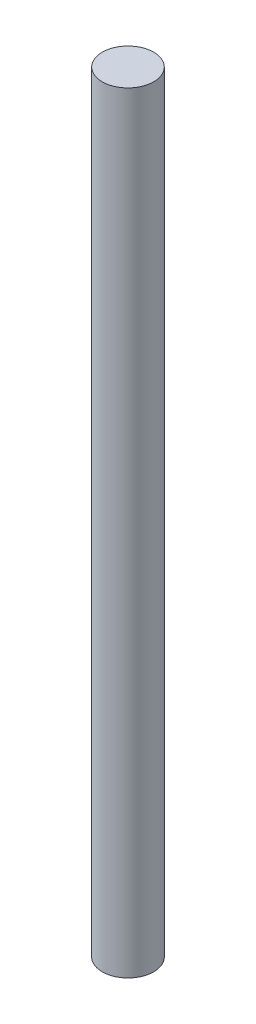
ISO-10303-21;
HEADER;
FILE_DESCRIPTION(('STEP AP214'),'2;1');
FILE_NAME('part.step','',(''),(''),'','','');
FILE_SCHEMA(('AUTOMOTIVE_DESIGN { 1 0 10303 214 1 1 1 1 }'));
ENDSEC;
DATA;
#1=APPLICATION_CONTEXT('core data for automotive mechanical design processes');
#2=APPLICATION_PROTOCOL_DEFINITION('international standard','automotive_design',2000,#1);
#3=PRODUCT_CONTEXT('',#1,'mechanical');
#4=PRODUCT('Part','Part','',(#3));
#5=PRODUCT_RELATED_PRODUCT_CATEGORY('part','',(#4));
#6=PRODUCT_DEFINITION_FORMATION('','',#4);
#7=PRODUCT_DEFINITION_CONTEXT('part definition',#1,'design');
#8=PRODUCT_DEFINITION('design','',#6,#7);
#9=PRODUCT_DEFINITION_SHAPE('','',#8);
#10=(LENGTH_UNIT() NAMED_UNIT(*) SI_UNIT(.MILLI.,.METRE.));
#11=(NAMED_UNIT(*) PLANE_ANGLE_UNIT() SI_UNIT($,.RADIAN.));
#12=(NAMED_UNIT(*) SI_UNIT($,.STERADIAN.) SOLID_ANGLE_UNIT());
#13=UNCERTAINTY_MEASURE_WITH_UNIT(LENGTH_MEASURE(1.E-05),#10,'distance_accuracy_value','');
#14=(GEOMETRIC_REPRESENTATION_CONTEXT(3) GLOBAL_UNCERTAINTY_ASSIGNED_CONTEXT((#13)) GLOBAL_UNIT_ASSIGNED_CONTEXT((#10,
#11,#12)) REPRESENTATION_CONTEXT('',''));
#15=CARTESIAN_POINT('',(0.,0.,0.));
#16=DIRECTION('',(0.,0.,1.));
#17=DIRECTION('',(1.,0.,0.));
#18=AXIS2_PLACEMENT_3D('',#15,#16,#17);
#19=CARTESIAN_POINT('',(0.,150.,0.));
#20=DIRECTION('',(0.,-1.,0.));
#21=DIRECTION('',(0.,0.,-1.));
#22=AXIS2_PLACEMENT_3D('',#19,#20,#21);
#23=CYLINDRICAL_SURFACE('',#22,5.);
#24=CARTESIAN_POINT('',(0.,150.,0.));
#25=DIRECTION('',(0.,1.,0.));
#26=DIRECTION('',(0.,0.,1.));
#27=AXIS2_PLACEMENT_3D('',#24,#25,#26);
#28=CIRCLE('',#27,5.);
#29=CARTESIAN_POINT('',(0.,150.,5.));
#30=VERTEX_POINT('',#29);
#31=EDGE_CURVE('E10',#30,#30,#28,.T.);
#32=ORIENTED_EDGE('',*,*,#31,.F.);
#33=EDGE_LOOP('',(#32));
#34=FACE_BOUND('',#33,.T.);
#35=CARTESIAN_POINT('',(0.,0.,0.));
#36=DIRECTION('',(0.,1.,0.));
#37=DIRECTION('',(0.,0.,1.));
#38=AXIS2_PLACEMENT_3D('',#35,#36,#37);
#39=CIRCLE('',#38,5.);
#40=CARTESIAN_POINT('',(0.,0.,5.));
#41=VERTEX_POINT('',#40);
#42=EDGE_CURVE('E44',#41,#41,#39,.T.);
#43=ORIENTED_EDGE('',*,*,#42,.T.);
#44=EDGE_LOOP('',(#43));
#45=FACE_BOUND('',#44,.T.);
#46=ADVANCED_FACE('F41',(#34,#45),#23,.T.);
#47=CARTESIAN_POINT('',(0.,150.,0.));
#48=DIRECTION('',(0.,1.,0.));
#49=DIRECTION('',(0.,0.,1.));
#50=AXIS2_PLACEMENT_3D('',#47,#48,#49);
#51=PLANE('',#50);
#52=ORIENTED_EDGE('',*,*,#31,.T.);
#53=EDGE_LOOP('',(#52));
#54=FACE_BOUND('',#53,.T.);
#55=ADVANCED_FACE('F58',(#54),#51,.T.);
#56=CARTESIAN_POINT('',(0.,0.,0.));
#57=DIRECTION('',(0.,1.,0.));
#58=DIRECTION('',(0.,0.,1.));
#59=AXIS2_PLACEMENT_3D('',#56,#57,#58);
#60=PLANE('',#59);
#61=ORIENTED_EDGE('',*,*,#42,.F.);
#62=EDGE_LOOP('',(#61));
#63=FACE_BOUND('',#62,.T.);
#64=ADVANCED_FACE('F56',(#63),#60,.F.);
#65=CLOSED_SHELL('',(#46,#55,#64));
#66=MANIFOLD_SOLID_BREP('B2',#65);
#67=ADVANCED_BREP_SHAPE_REPRESENTATION('',(#18,#66),#14);
#68=SHAPE_DEFINITION_REPRESENTATION(#9,#67);
ENDSEC;
END-ISO-10303-21;
